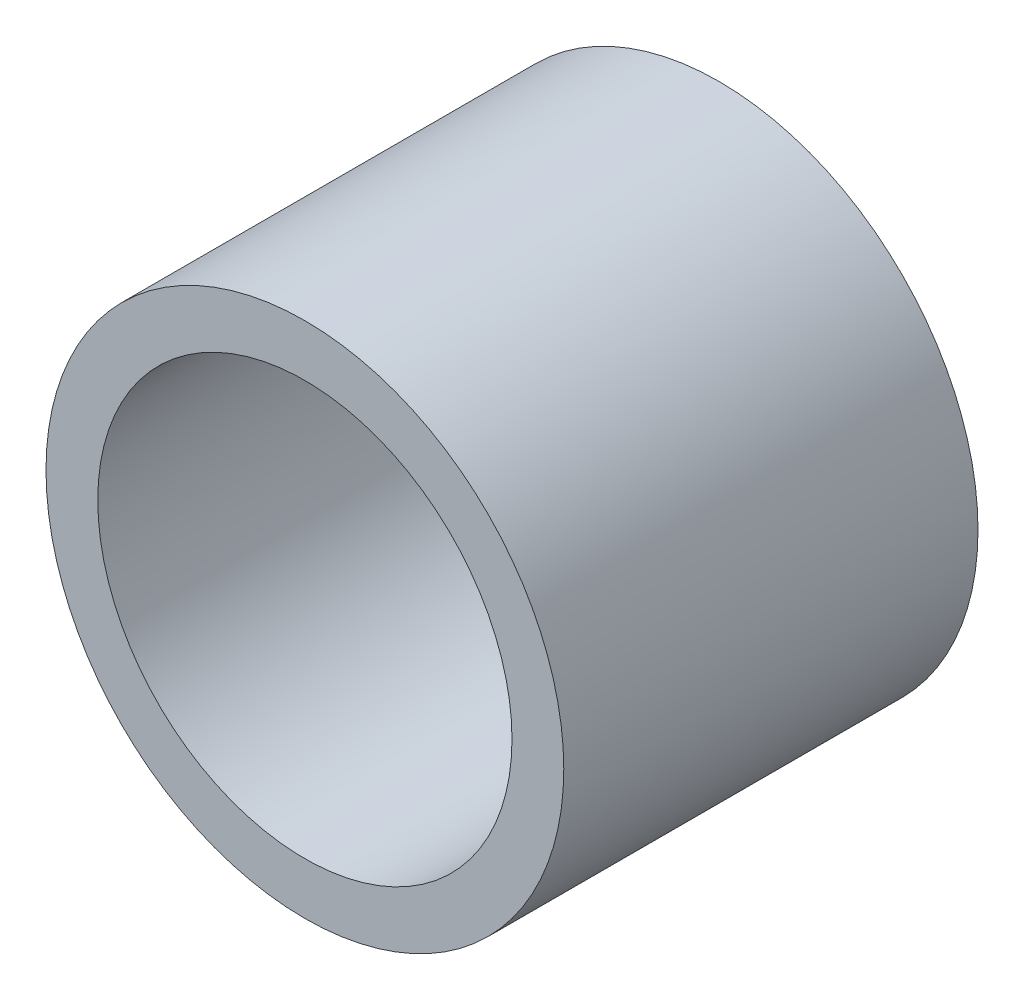
ISO-10303-21;
HEADER;
FILE_DESCRIPTION(('STEP AP214'),'2;1');
FILE_NAME('part.step','',(''),(''),'','','');
FILE_SCHEMA(('AUTOMOTIVE_DESIGN { 1 0 10303 214 1 1 1 1 }'));
ENDSEC;
DATA;
#1=APPLICATION_CONTEXT('core data for automotive mechanical design processes');
#2=APPLICATION_PROTOCOL_DEFINITION('international standard','automotive_design',2000,#1);
#3=PRODUCT_CONTEXT('',#1,'mechanical');
#4=PRODUCT('Part','Part','',(#3));
#5=PRODUCT_RELATED_PRODUCT_CATEGORY('part','',(#4));
#6=PRODUCT_DEFINITION_FORMATION('','',#4);
#7=PRODUCT_DEFINITION_CONTEXT('part definition',#1,'design');
#8=PRODUCT_DEFINITION('design','',#6,#7);
#9=PRODUCT_DEFINITION_SHAPE('','',#8);
#10=(LENGTH_UNIT() NAMED_UNIT(*) SI_UNIT(.MILLI.,.METRE.));
#11=(NAMED_UNIT(*) PLANE_ANGLE_UNIT() SI_UNIT($,.RADIAN.));
#12=(NAMED_UNIT(*) SI_UNIT($,.STERADIAN.) SOLID_ANGLE_UNIT());
#13=UNCERTAINTY_MEASURE_WITH_UNIT(LENGTH_MEASURE(1.E-05),#10,'distance_accuracy_value','');
#14=(GEOMETRIC_REPRESENTATION_CONTEXT(3) GLOBAL_UNCERTAINTY_ASSIGNED_CONTEXT((#13)) GLOBAL_UNIT_ASSIGNED_CONTEXT((#10,
#11,#12)) REPRESENTATION_CONTEXT('',''));
#15=CARTESIAN_POINT('',(0.,0.,0.));
#16=DIRECTION('',(0.,0.,1.));
#17=DIRECTION('',(1.,0.,0.));
#18=AXIS2_PLACEMENT_3D('',#15,#16,#17);
#19=CARTESIAN_POINT('',(0.,0.,50.8));
#20=DIRECTION('',(0.,0.,-1.));
#21=DIRECTION('',(-1.,0.,0.));
#22=AXIS2_PLACEMENT_3D('',#19,#20,#21);
#23=CYLINDRICAL_SURFACE('',#22,31.75);
#24=CARTESIAN_POINT('',(0.,0.,50.8));
#25=DIRECTION('',(0.,0.,1.));
#26=DIRECTION('',(1.,0.,0.));
#27=AXIS2_PLACEMENT_3D('',#24,#25,#26);
#28=CIRCLE('',#27,31.75);
#29=CARTESIAN_POINT('',(31.75,0.,50.8));
#30=VERTEX_POINT('',#29);
#31=EDGE_CURVE('E10',#30,#30,#28,.T.);
#32=ORIENTED_EDGE('',*,*,#31,.F.);
#33=EDGE_LOOP('',(#32));
#34=FACE_BOUND('',#33,.T.);
#35=CARTESIAN_POINT('',(0.,0.,0.));
#36=DIRECTION('',(0.,0.,1.));
#37=DIRECTION('',(1.,0.,0.));
#38=AXIS2_PLACEMENT_3D('',#35,#36,#37);
#39=CIRCLE('',#38,31.75);
#40=CARTESIAN_POINT('',(31.75,0.,0.));
#41=VERTEX_POINT('',#40);
#42=EDGE_CURVE('E40',#41,#41,#39,.T.);
#43=ORIENTED_EDGE('',*,*,#42,.T.);
#44=EDGE_LOOP('',(#43));
#45=FACE_BOUND('',#44,.T.);
#46=ADVANCED_FACE('F37',(#34,#45),#23,.T.);
#47=CARTESIAN_POINT('',(0.,0.,50.8));
#48=DIRECTION('',(0.,0.,1.));
#49=DIRECTION('',(1.,0.,0.));
#50=AXIS2_PLACEMENT_3D('',#47,#48,#49);
#51=PLANE('',#50);
#52=CARTESIAN_POINT('',(0.,0.,50.8));
#53=DIRECTION('',(0.,0.,1.));
#54=DIRECTION('',(1.,0.,0.));
#55=AXIS2_PLACEMENT_3D('',#52,#53,#54);
#56=CIRCLE('',#55,25.4);
#57=CARTESIAN_POINT('',(25.4,0.,50.8));
#58=VERTEX_POINT('',#57);
#59=EDGE_CURVE('E49',#58,#58,#56,.T.);
#60=ORIENTED_EDGE('',*,*,#59,.F.);
#61=EDGE_LOOP('',(#60));
#62=FACE_BOUND('',#61,.T.);
#63=ORIENTED_EDGE('',*,*,#31,.T.);
#64=EDGE_LOOP('',(#63));
#65=FACE_BOUND('',#64,.T.);
#66=ADVANCED_FACE('F74',(#62,#65),#51,.T.);
#67=CARTESIAN_POINT('',(0.,0.,0.));
#68=DIRECTION('',(0.,0.,1.));
#69=DIRECTION('',(1.,0.,0.));
#70=AXIS2_PLACEMENT_3D('',#67,#68,#69);
#71=PLANE('',#70);
#72=CARTESIAN_POINT('',(0.,0.,0.));
#73=DIRECTION('',(0.,0.,-1.));
#74=DIRECTION('',(-1.,0.,0.));
#75=AXIS2_PLACEMENT_3D('',#72,#73,#74);
#76=CIRCLE('',#75,6.35);
#77=CARTESIAN_POINT('',(-6.35,0.,0.));
#78=VERTEX_POINT('',#77);
#79=EDGE_CURVE('E55',#78,#78,#76,.T.);
#80=ORIENTED_EDGE('',*,*,#79,.F.);
#81=EDGE_LOOP('',(#80));
#82=FACE_BOUND('',#81,.T.);
#83=ORIENTED_EDGE('',*,*,#42,.F.);
#84=EDGE_LOOP('',(#83));
#85=FACE_BOUND('',#84,.T.);
#86=ADVANCED_FACE('F70',(#82,#85),#71,.F.);
#87=CARTESIAN_POINT('',(0.,0.,7.35));
#88=DIRECTION('',(0.,0.,1.));
#89=DIRECTION('',(1.,0.,0.));
#90=AXIS2_PLACEMENT_3D('',#87,#88,#89);
#91=CYLINDRICAL_SURFACE('',#90,25.4);
#92=CARTESIAN_POINT('',(0.,0.,7.35));
#93=DIRECTION('',(0.,0.,1.));
#94=DIRECTION('',(1.,0.,0.));
#95=AXIS2_PLACEMENT_3D('',#92,#93,#94);
#96=CIRCLE('',#95,25.4);
#97=CARTESIAN_POINT('',(25.4,0.,7.35));
#98=VERTEX_POINT('',#97);
#99=EDGE_CURVE('E47',#98,#98,#96,.T.);
#100=ORIENTED_EDGE('',*,*,#99,.F.);
#101=EDGE_LOOP('',(#100));
#102=FACE_BOUND('',#101,.T.);
#103=ORIENTED_EDGE('',*,*,#59,.T.);
#104=EDGE_LOOP('',(#103));
#105=FACE_BOUND('',#104,.T.);
#106=ADVANCED_FACE('F73',(#102,#105),#91,.F.);
#107=CARTESIAN_POINT('',(0.,0.,7.35));
#108=DIRECTION('',(0.,0.,1.));
#109=DIRECTION('',(1.,0.,0.));
#110=AXIS2_PLACEMENT_3D('',#107,#108,#109);
#111=PLANE('',#110);
#112=CARTESIAN_POINT('',(0.,0.,7.35));
#113=DIRECTION('',(0.,0.,-1.));
#114=DIRECTION('',(-1.,0.,0.));
#115=AXIS2_PLACEMENT_3D('',#112,#113,#114);
#116=CIRCLE('',#115,6.35);
#117=CARTESIAN_POINT('',(-6.35,0.,7.35));
#118=VERTEX_POINT('',#117);
#119=EDGE_CURVE('E52',#118,#118,#116,.T.);
#120=ORIENTED_EDGE('',*,*,#119,.T.);
#121=EDGE_LOOP('',(#120));
#122=FACE_BOUND('',#121,.T.);
#123=ORIENTED_EDGE('',*,*,#99,.T.);
#124=EDGE_LOOP('',(#123));
#125=FACE_BOUND('',#124,.T.);
#126=ADVANCED_FACE('F61',(#122,#125),#111,.T.);
#127=CARTESIAN_POINT('',(0.,0.,7.35));
#128=DIRECTION('',(0.,0.,-1.));
#129=DIRECTION('',(-1.,0.,0.));
#130=AXIS2_PLACEMENT_3D('',#127,#128,#129);
#131=CYLINDRICAL_SURFACE('',#130,6.35);
#132=ORIENTED_EDGE('',*,*,#119,.F.);
#133=EDGE_LOOP('',(#132));
#134=FACE_BOUND('',#133,.T.);
#135=ORIENTED_EDGE('',*,*,#79,.T.);
#136=EDGE_LOOP('',(#135));
#137=FACE_BOUND('',#136,.T.);
#138=ADVANCED_FACE('F64',(#134,#137),#131,.F.);
#139=CLOSED_SHELL('',(#46,#66,#86,#106,#126,#138));
#140=MANIFOLD_SOLID_BREP('B2',#139);
#141=ADVANCED_BREP_SHAPE_REPRESENTATION('',(#18,#140),#14);
#142=SHAPE_DEFINITION_REPRESENTATION(#9,#141);
ENDSEC;
END-ISO-10303-21;
